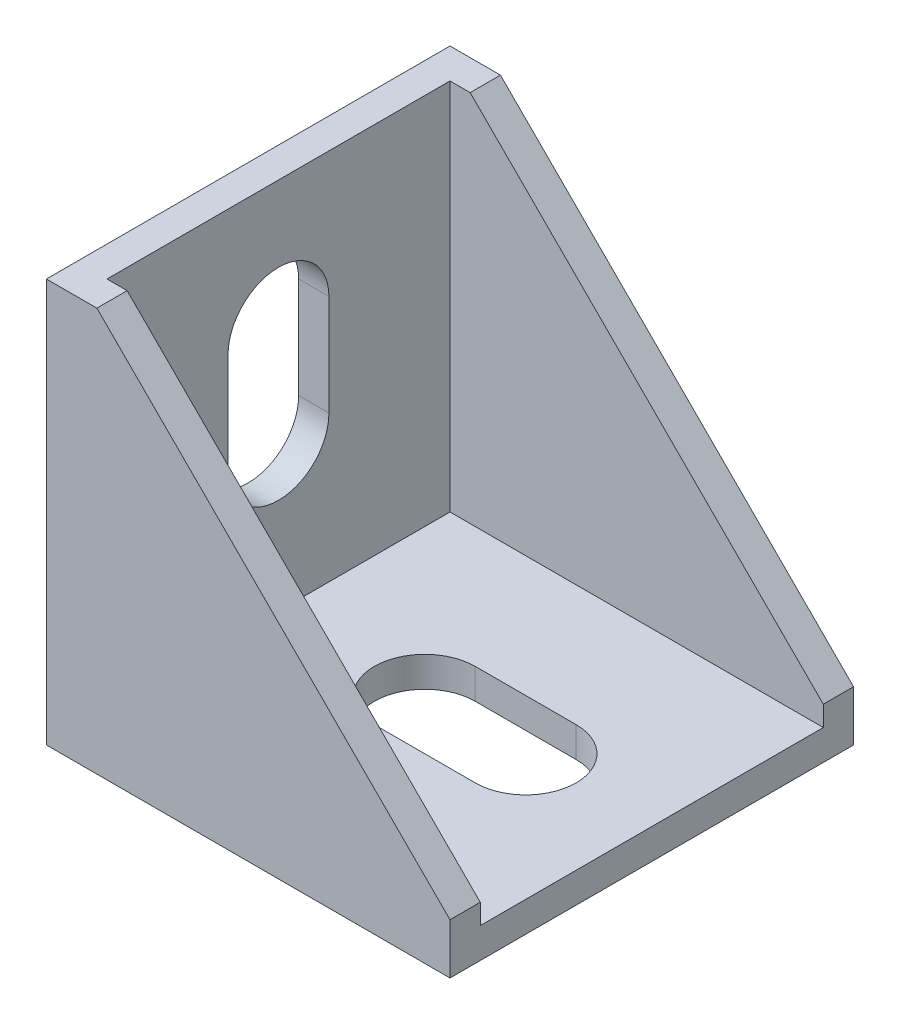
ISO-10303-21;
HEADER;
FILE_DESCRIPTION(('STEP AP214'),'2;1');
FILE_NAME('part.step','',(''),(''),'','','');
FILE_SCHEMA(('AUTOMOTIVE_DESIGN { 1 0 10303 214 1 1 1 1 }'));
ENDSEC;
DATA;
#1=APPLICATION_CONTEXT('core data for automotive mechanical design processes');
#2=APPLICATION_PROTOCOL_DEFINITION('international standard','automotive_design',2000,#1);
#3=PRODUCT_CONTEXT('',#1,'mechanical');
#4=PRODUCT('Part','Part','',(#3));
#5=PRODUCT_RELATED_PRODUCT_CATEGORY('part','',(#4));
#6=PRODUCT_DEFINITION_FORMATION('','',#4);
#7=PRODUCT_DEFINITION_CONTEXT('part definition',#1,'design');
#8=PRODUCT_DEFINITION('design','',#6,#7);
#9=PRODUCT_DEFINITION_SHAPE('','',#8);
#10=(LENGTH_UNIT() NAMED_UNIT(*) SI_UNIT(.MILLI.,.METRE.));
#11=(NAMED_UNIT(*) PLANE_ANGLE_UNIT() SI_UNIT($,.RADIAN.));
#12=(NAMED_UNIT(*) SI_UNIT($,.STERADIAN.) SOLID_ANGLE_UNIT());
#13=UNCERTAINTY_MEASURE_WITH_UNIT(LENGTH_MEASURE(1.E-05),#10,'distance_accuracy_value','');
#14=(GEOMETRIC_REPRESENTATION_CONTEXT(3) GLOBAL_UNCERTAINTY_ASSIGNED_CONTEXT((#13)) GLOBAL_UNIT_ASSIGNED_CONTEXT((#10,
#11,#12)) REPRESENTATION_CONTEXT('',''));
#15=CARTESIAN_POINT('',(0.,0.,0.));
#16=DIRECTION('',(0.,0.,1.));
#17=DIRECTION('',(1.,0.,0.));
#18=AXIS2_PLACEMENT_3D('',#15,#16,#17);
#19=CARTESIAN_POINT('',(40.,0.,20.));
#20=DIRECTION('',(0.,1.,0.));
#21=DIRECTION('',(-1.,0.,0.));
#22=AXIS2_PLACEMENT_3D('',#19,#20,#21);
#23=PLANE('',#22);
#24=DIRECTION('',(1.,0.,0.));
#25=VECTOR('',#24,1.);
#26=CARTESIAN_POINT('',(40.,0.,-20.));
#27=LINE('',#26,#25);
#28=CARTESIAN_POINT('',(0.,0.,-20.));
#29=VERTEX_POINT('',#28);
#30=CARTESIAN_POINT('',(40.,0.,-20.));
#31=VERTEX_POINT('',#30);
#32=EDGE_CURVE('E260',#29,#31,#27,.T.);
#33=ORIENTED_EDGE('',*,*,#32,.T.);
#34=DIRECTION('',(0.,0.,-1.));
#35=VECTOR('',#34,1.);
#36=CARTESIAN_POINT('',(40.,0.,20.));
#37=LINE('',#36,#35);
#38=CARTESIAN_POINT('',(40.,0.,20.));
#39=VERTEX_POINT('',#38);
#40=EDGE_CURVE('E268',#39,#31,#37,.T.);
#41=ORIENTED_EDGE('',*,*,#40,.F.);
#42=DIRECTION('',(1.,0.,0.));
#43=VECTOR('',#42,1.);
#44=CARTESIAN_POINT('',(40.,0.,20.));
#45=LINE('',#44,#43);
#46=CARTESIAN_POINT('',(0.,0.,20.));
#47=VERTEX_POINT('',#46);
#48=EDGE_CURVE('E266',#47,#39,#45,.T.);
#49=ORIENTED_EDGE('',*,*,#48,.F.);
#50=DIRECTION('',(0.,0.,-1.));
#51=VECTOR('',#50,1.);
#52=CARTESIAN_POINT('',(0.,0.,20.));
#53=LINE('',#52,#51);
#54=EDGE_CURVE('E281',#47,#29,#53,.T.);
#55=ORIENTED_EDGE('',*,*,#54,.T.);
#56=EDGE_LOOP('',(#33,#41,#49,#55));
#57=FACE_BOUND('',#56,.T.);
#58=CARTESIAN_POINT('',(27.5,0.,0.));
#59=DIRECTION('',(0.,1.,0.));
#60=DIRECTION('',(-1.,0.,0.));
#61=AXIS2_PLACEMENT_3D('',#58,#59,#60);
#62=CIRCLE('',#61,5.);
#63=CARTESIAN_POINT('',(27.5,0.,-5.));
#64=VERTEX_POINT('',#63);
#65=CARTESIAN_POINT('',(27.5,0.,5.));
#66=VERTEX_POINT('',#65);
#67=EDGE_CURVE('E189',#64,#66,#62,.F.);
#68=ORIENTED_EDGE('',*,*,#67,.F.);
#69=DIRECTION('',(1.,0.,0.));
#70=VECTOR('',#69,1.);
#71=CARTESIAN_POINT('',(40.,0.,-5.));
#72=LINE('',#71,#70);
#73=CARTESIAN_POINT('',(17.5,0.,-5.));
#74=VERTEX_POINT('',#73);
#75=EDGE_CURVE('E182',#74,#64,#72,.T.);
#76=ORIENTED_EDGE('',*,*,#75,.F.);
#77=CARTESIAN_POINT('',(17.5,0.,0.));
#78=DIRECTION('',(0.,1.,0.));
#79=DIRECTION('',(-1.,0.,0.));
#80=AXIS2_PLACEMENT_3D('',#77,#78,#79);
#81=CIRCLE('',#80,5.);
#82=CARTESIAN_POINT('',(17.5,0.,5.));
#83=VERTEX_POINT('',#82);
#84=EDGE_CURVE('E163',#83,#74,#81,.F.);
#85=ORIENTED_EDGE('',*,*,#84,.F.);
#86=DIRECTION('',(-1.,0.,0.));
#87=VECTOR('',#86,1.);
#88=CARTESIAN_POINT('',(40.,0.,5.));
#89=LINE('',#88,#87);
#90=EDGE_CURVE('E187',#66,#83,#89,.T.);
#91=ORIENTED_EDGE('',*,*,#90,.F.);
#92=EDGE_LOOP('',(#68,#76,#85,#91));
#93=FACE_BOUND('',#92,.T.);
#94=ADVANCED_FACE('F32',(#57,#93),#23,.F.);
#95=CARTESIAN_POINT('',(40.,3.,20.));
#96=DIRECTION('',(0.,1.,0.));
#97=DIRECTION('',(-1.,0.,0.));
#98=AXIS2_PLACEMENT_3D('',#95,#96,#97);
#99=PLANE('',#98);
#100=DIRECTION('',(1.,0.,0.));
#101=VECTOR('',#100,1.);
#102=CARTESIAN_POINT('',(0.,3.,-17.));
#103=LINE('',#102,#101);
#104=CARTESIAN_POINT('',(3.,3.,-17.));
#105=VERTEX_POINT('',#104);
#106=CARTESIAN_POINT('',(40.,3.,-17.));
#107=VERTEX_POINT('',#106);
#108=EDGE_CURVE('E226',#105,#107,#103,.T.);
#109=ORIENTED_EDGE('',*,*,#108,.F.);
#110=DIRECTION('',(0.,0.,-1.));
#111=VECTOR('',#110,1.);
#112=CARTESIAN_POINT('',(3.,3.,20.));
#113=LINE('',#112,#111);
#114=CARTESIAN_POINT('',(3.,3.,17.));
#115=VERTEX_POINT('',#114);
#116=EDGE_CURVE('E228',#115,#105,#113,.T.);
#117=ORIENTED_EDGE('',*,*,#116,.F.);
#118=DIRECTION('',(1.,0.,0.));
#119=VECTOR('',#118,1.);
#120=CARTESIAN_POINT('',(0.,3.,17.));
#121=LINE('',#120,#119);
#122=CARTESIAN_POINT('',(40.,3.,17.));
#123=VERTEX_POINT('',#122);
#124=EDGE_CURVE('E235',#115,#123,#121,.T.);
#125=ORIENTED_EDGE('',*,*,#124,.T.);
#126=DIRECTION('',(0.,0.,-1.));
#127=VECTOR('',#126,1.);
#128=CARTESIAN_POINT('',(40.,3.,20.));
#129=LINE('',#128,#127);
#130=EDGE_CURVE('E232',#123,#107,#129,.T.);
#131=ORIENTED_EDGE('',*,*,#130,.T.);
#132=EDGE_LOOP('',(#109,#117,#125,#131));
#133=FACE_BOUND('',#132,.T.);
#134=DIRECTION('',(1.,0.,0.));
#135=VECTOR('',#134,1.);
#136=CARTESIAN_POINT('',(27.5,2.99999999999999,-5.));
#137=LINE('',#136,#135);
#138=CARTESIAN_POINT('',(17.5,3.,-5.));
#139=VERTEX_POINT('',#138);
#140=CARTESIAN_POINT('',(27.5,3.,-5.));
#141=VERTEX_POINT('',#140);
#142=EDGE_CURVE('E169',#139,#141,#137,.T.);
#143=ORIENTED_EDGE('',*,*,#142,.T.);
#144=CARTESIAN_POINT('',(27.5,2.99999999999999,0.));
#145=DIRECTION('',(0.,-1.,0.));
#146=DIRECTION('',(0.,0.,-1.));
#147=AXIS2_PLACEMENT_3D('',#144,#145,#146);
#148=CIRCLE('',#147,5.);
#149=CARTESIAN_POINT('',(27.5,2.99999999999999,5.));
#150=VERTEX_POINT('',#149);
#151=EDGE_CURVE('E55',#141,#150,#148,.T.);
#152=ORIENTED_EDGE('',*,*,#151,.T.);
#153=DIRECTION('',(-1.,0.,0.));
#154=VECTOR('',#153,1.);
#155=CARTESIAN_POINT('',(27.5,2.99999999999999,5.));
#156=LINE('',#155,#154);
#157=CARTESIAN_POINT('',(17.5,3.,5.));
#158=VERTEX_POINT('',#157);
#159=EDGE_CURVE('E175',#150,#158,#156,.T.);
#160=ORIENTED_EDGE('',*,*,#159,.T.);
#161=CARTESIAN_POINT('',(17.5,3.,0.));
#162=DIRECTION('',(0.,-1.,0.));
#163=DIRECTION('',(0.,0.,-1.));
#164=AXIS2_PLACEMENT_3D('',#161,#162,#163);
#165=CIRCLE('',#164,5.);
#166=EDGE_CURVE('E160',#158,#139,#165,.T.);
#167=ORIENTED_EDGE('',*,*,#166,.T.);
#168=EDGE_LOOP('',(#143,#152,#160,#167));
#169=FACE_BOUND('',#168,.T.);
#170=ADVANCED_FACE('F173',(#133,#169),#99,.T.);
#171=CARTESIAN_POINT('',(40.,5.,20.));
#172=DIRECTION('',(-1.,0.,0.));
#173=DIRECTION('',(0.,0.,1.));
#174=AXIS2_PLACEMENT_3D('',#171,#172,#173);
#175=PLANE('',#174);
#176=DIRECTION('',(0.,1.,0.));
#177=VECTOR('',#176,1.);
#178=CARTESIAN_POINT('',(40.,0.,-17.));
#179=LINE('',#178,#177);
#180=CARTESIAN_POINT('',(40.,5.,-17.));
#181=VERTEX_POINT('',#180);
#182=EDGE_CURVE('E223',#107,#181,#179,.T.);
#183=ORIENTED_EDGE('',*,*,#182,.F.);
#184=ORIENTED_EDGE('',*,*,#130,.F.);
#185=DIRECTION('',(0.,1.,0.));
#186=VECTOR('',#185,1.);
#187=CARTESIAN_POINT('',(40.,0.,17.));
#188=LINE('',#187,#186);
#189=CARTESIAN_POINT('',(40.,5.,17.));
#190=VERTEX_POINT('',#189);
#191=EDGE_CURVE('E238',#123,#190,#188,.T.);
#192=ORIENTED_EDGE('',*,*,#191,.T.);
#193=DIRECTION('',(0.,0.,-1.));
#194=VECTOR('',#193,1.);
#195=CARTESIAN_POINT('',(40.,5.,20.));
#196=LINE('',#195,#194);
#197=CARTESIAN_POINT('',(40.,5.,20.));
#198=VERTEX_POINT('',#197);
#199=EDGE_CURVE('E11',#198,#190,#196,.T.);
#200=ORIENTED_EDGE('',*,*,#199,.F.);
#201=DIRECTION('',(0.,1.,0.));
#202=VECTOR('',#201,1.);
#203=CARTESIAN_POINT('',(40.,5.,20.));
#204=LINE('',#203,#202);
#205=EDGE_CURVE('E256',#39,#198,#204,.T.);
#206=ORIENTED_EDGE('',*,*,#205,.F.);
#207=ORIENTED_EDGE('',*,*,#40,.T.);
#208=DIRECTION('',(0.,1.,0.));
#209=VECTOR('',#208,1.);
#210=CARTESIAN_POINT('',(40.,5.,-20.));
#211=LINE('',#210,#209);
#212=CARTESIAN_POINT('',(40.,5.,-20.));
#213=VERTEX_POINT('',#212);
#214=EDGE_CURVE('E242',#31,#213,#211,.T.);
#215=ORIENTED_EDGE('',*,*,#214,.T.);
#216=EDGE_CURVE('E40',#181,#213,#196,.T.);
#217=ORIENTED_EDGE('',*,*,#216,.F.);
#218=EDGE_LOOP('',(#183,#184,#192,#200,#206,#207,#215,#217));
#219=FACE_BOUND('',#218,.T.);
#220=ADVANCED_FACE('F34',(#219),#175,.F.);
#221=CARTESIAN_POINT('',(5.,40.,20.));
#222=DIRECTION('',(-0.707106781186548,-0.707106781186548,0.));
#223=DIRECTION('',(0.707106781186548,-0.707106781186548,0.));
#224=AXIS2_PLACEMENT_3D('',#221,#222,#223);
#225=PLANE('',#224);
#226=DIRECTION('',(-0.707106781186548,0.707106781186548,0.));
#227=VECTOR('',#226,1.);
#228=CARTESIAN_POINT('',(22.5,22.5,-17.));
#229=LINE('',#228,#227);
#230=CARTESIAN_POINT('',(5.,40.,-17.));
#231=VERTEX_POINT('',#230);
#232=EDGE_CURVE('E253',#181,#231,#229,.T.);
#233=ORIENTED_EDGE('',*,*,#232,.F.);
#234=ORIENTED_EDGE('',*,*,#216,.T.);
#235=DIRECTION('',(-0.707106781186548,0.707106781186548,0.));
#236=VECTOR('',#235,1.);
#237=CARTESIAN_POINT('',(5.,40.,-20.));
#238=LINE('',#237,#236);
#239=CARTESIAN_POINT('',(5.,40.,-20.));
#240=VERTEX_POINT('',#239);
#241=EDGE_CURVE('E271',#213,#240,#238,.T.);
#242=ORIENTED_EDGE('',*,*,#241,.T.);
#243=DIRECTION('',(0.,0.,-1.));
#244=VECTOR('',#243,1.);
#245=CARTESIAN_POINT('',(5.,40.,20.));
#246=LINE('',#245,#244);
#247=EDGE_CURVE('E286',#231,#240,#246,.T.);
#248=ORIENTED_EDGE('',*,*,#247,.F.);
#249=EDGE_LOOP('',(#233,#234,#242,#248));
#250=FACE_BOUND('',#249,.T.);
#251=ADVANCED_FACE('F300',(#250),#225,.F.);
#252=CARTESIAN_POINT('',(0.,40.,20.));
#253=DIRECTION('',(0.,-1.,0.));
#254=DIRECTION('',(0.,0.,-1.));
#255=AXIS2_PLACEMENT_3D('',#252,#253,#254);
#256=PLANE('',#255);
#257=DIRECTION('',(-1.,0.,0.));
#258=VECTOR('',#257,1.);
#259=CARTESIAN_POINT('',(0.,40.,-17.));
#260=LINE('',#259,#258);
#261=CARTESIAN_POINT('',(3.,40.,-17.));
#262=VERTEX_POINT('',#261);
#263=EDGE_CURVE('E227',#231,#262,#260,.T.);
#264=ORIENTED_EDGE('',*,*,#263,.F.);
#265=ORIENTED_EDGE('',*,*,#247,.T.);
#266=DIRECTION('',(-1.,0.,0.));
#267=VECTOR('',#266,1.);
#268=CARTESIAN_POINT('',(0.,40.,-20.));
#269=LINE('',#268,#267);
#270=CARTESIAN_POINT('',(0.,40.,-20.));
#271=VERTEX_POINT('',#270);
#272=EDGE_CURVE('E274',#240,#271,#269,.T.);
#273=ORIENTED_EDGE('',*,*,#272,.T.);
#274=DIRECTION('',(0.,0.,-1.));
#275=VECTOR('',#274,1.);
#276=CARTESIAN_POINT('',(0.,40.,20.));
#277=LINE('',#276,#275);
#278=CARTESIAN_POINT('',(0.,40.,20.));
#279=VERTEX_POINT('',#278);
#280=EDGE_CURVE('E284',#279,#271,#277,.T.);
#281=ORIENTED_EDGE('',*,*,#280,.F.);
#282=DIRECTION('',(-1.,0.,0.));
#283=VECTOR('',#282,1.);
#284=CARTESIAN_POINT('',(0.,40.,20.));
#285=LINE('',#284,#283);
#286=CARTESIAN_POINT('',(5.,40.,20.));
#287=VERTEX_POINT('',#286);
#288=EDGE_CURVE('E262',#287,#279,#285,.T.);
#289=ORIENTED_EDGE('',*,*,#288,.F.);
#290=CARTESIAN_POINT('',(5.,40.,17.));
#291=VERTEX_POINT('',#290);
#292=EDGE_CURVE('E287',#287,#291,#246,.T.);
#293=ORIENTED_EDGE('',*,*,#292,.T.);
#294=DIRECTION('',(-1.,0.,0.));
#295=VECTOR('',#294,1.);
#296=CARTESIAN_POINT('',(0.,40.,17.));
#297=LINE('',#296,#295);
#298=CARTESIAN_POINT('',(3.,40.,17.));
#299=VERTEX_POINT('',#298);
#300=EDGE_CURVE('E236',#291,#299,#297,.T.);
#301=ORIENTED_EDGE('',*,*,#300,.T.);
#302=DIRECTION('',(0.,0.,-1.));
#303=VECTOR('',#302,1.);
#304=CARTESIAN_POINT('',(3.,40.,20.));
#305=LINE('',#304,#303);
#306=EDGE_CURVE('E231',#299,#262,#305,.T.);
#307=ORIENTED_EDGE('',*,*,#306,.T.);
#308=EDGE_LOOP('',(#264,#265,#273,#281,#289,#293,#301,#307));
#309=FACE_BOUND('',#308,.T.);
#310=ADVANCED_FACE('F294',(#309),#256,.F.);
#311=ORIENTED_EDGE('',*,*,#199,.T.);
#312=DIRECTION('',(-0.707106781186548,0.707106781186548,0.));
#313=VECTOR('',#312,1.);
#314=CARTESIAN_POINT('',(22.5,22.5,17.));
#315=LINE('',#314,#313);
#316=EDGE_CURVE('E245',#190,#291,#315,.T.);
#317=ORIENTED_EDGE('',*,*,#316,.T.);
#318=ORIENTED_EDGE('',*,*,#292,.F.);
#319=DIRECTION('',(-0.707106781186548,0.707106781186548,0.));
#320=VECTOR('',#319,1.);
#321=CARTESIAN_POINT('',(5.,40.,20.));
#322=LINE('',#321,#320);
#323=EDGE_CURVE('E259',#198,#287,#322,.T.);
#324=ORIENTED_EDGE('',*,*,#323,.F.);
#325=EDGE_LOOP('',(#311,#317,#318,#324));
#326=FACE_BOUND('',#325,.T.);
#327=ADVANCED_FACE('F320',(#326),#225,.F.);
#328=CARTESIAN_POINT('',(0.,0.,20.));
#329=DIRECTION('',(1.,0.,0.));
#330=DIRECTION('',(0.,0.,-1.));
#331=AXIS2_PLACEMENT_3D('',#328,#329,#330);
#332=PLANE('',#331);
#333=DIRECTION('',(0.,1.,0.));
#334=VECTOR('',#333,1.);
#335=CARTESIAN_POINT('',(0.,0.,-5.));
#336=LINE('',#335,#334);
#337=CARTESIAN_POINT('',(0.,17.5,-5.));
#338=VERTEX_POINT('',#337);
#339=CARTESIAN_POINT('',(0.,27.5,-5.));
#340=VERTEX_POINT('',#339);
#341=EDGE_CURVE('E217',#338,#340,#336,.T.);
#342=ORIENTED_EDGE('',*,*,#341,.T.);
#343=CARTESIAN_POINT('',(0.,27.5,0.));
#344=DIRECTION('',(1.,0.,0.));
#345=DIRECTION('',(0.,0.,-1.));
#346=AXIS2_PLACEMENT_3D('',#343,#344,#345);
#347=CIRCLE('',#346,5.);
#348=CARTESIAN_POINT('',(0.,27.5,5.));
#349=VERTEX_POINT('',#348);
#350=EDGE_CURVE('E220',#340,#349,#347,.T.);
#351=ORIENTED_EDGE('',*,*,#350,.T.);
#352=DIRECTION('',(0.,-1.,0.));
#353=VECTOR('',#352,1.);
#354=CARTESIAN_POINT('',(0.,0.,5.));
#355=LINE('',#354,#353);
#356=CARTESIAN_POINT('',(0.,17.5,5.));
#357=VERTEX_POINT('',#356);
#358=EDGE_CURVE('E205',#349,#357,#355,.T.);
#359=ORIENTED_EDGE('',*,*,#358,.T.);
#360=CARTESIAN_POINT('',(0.,17.5,0.));
#361=DIRECTION('',(1.,0.,0.));
#362=DIRECTION('',(0.,0.,-1.));
#363=AXIS2_PLACEMENT_3D('',#360,#361,#362);
#364=CIRCLE('',#363,5.);
#365=EDGE_CURVE('E214',#357,#338,#364,.T.);
#366=ORIENTED_EDGE('',*,*,#365,.T.);
#367=EDGE_LOOP('',(#342,#351,#359,#366));
#368=FACE_BOUND('',#367,.T.);
#369=DIRECTION('',(0.,-1.,0.));
#370=VECTOR('',#369,1.);
#371=CARTESIAN_POINT('',(0.,0.,-20.));
#372=LINE('',#371,#370);
#373=EDGE_CURVE('E276',#271,#29,#372,.T.);
#374=ORIENTED_EDGE('',*,*,#373,.T.);
#375=ORIENTED_EDGE('',*,*,#54,.F.);
#376=DIRECTION('',(0.,-1.,0.));
#377=VECTOR('',#376,1.);
#378=CARTESIAN_POINT('',(0.,0.,20.));
#379=LINE('',#378,#377);
#380=EDGE_CURVE('E264',#279,#47,#379,.T.);
#381=ORIENTED_EDGE('',*,*,#380,.F.);
#382=ORIENTED_EDGE('',*,*,#280,.T.);
#383=EDGE_LOOP('',(#374,#375,#381,#382));
#384=FACE_BOUND('',#383,.T.);
#385=ADVANCED_FACE('F309',(#368,#384),#332,.F.);
#386=CARTESIAN_POINT('',(0.,0.,20.));
#387=DIRECTION('',(0.,0.,-1.));
#388=DIRECTION('',(-1.,0.,0.));
#389=AXIS2_PLACEMENT_3D('',#386,#387,#388);
#390=PLANE('',#389);
#391=ORIENTED_EDGE('',*,*,#205,.T.);
#392=ORIENTED_EDGE('',*,*,#323,.T.);
#393=ORIENTED_EDGE('',*,*,#288,.T.);
#394=ORIENTED_EDGE('',*,*,#380,.T.);
#395=ORIENTED_EDGE('',*,*,#48,.T.);
#396=EDGE_LOOP('',(#391,#392,#393,#394,#395));
#397=FACE_BOUND('',#396,.T.);
#398=ADVANCED_FACE('F317',(#397),#390,.F.);
#399=CARTESIAN_POINT('',(0.,0.,-20.));
#400=DIRECTION('',(0.,0.,-1.));
#401=DIRECTION('',(-1.,0.,0.));
#402=AXIS2_PLACEMENT_3D('',#399,#400,#401);
#403=PLANE('',#402);
#404=ORIENTED_EDGE('',*,*,#214,.F.);
#405=ORIENTED_EDGE('',*,*,#32,.F.);
#406=ORIENTED_EDGE('',*,*,#373,.F.);
#407=ORIENTED_EDGE('',*,*,#272,.F.);
#408=ORIENTED_EDGE('',*,*,#241,.F.);
#409=EDGE_LOOP('',(#404,#405,#406,#407,#408));
#410=FACE_BOUND('',#409,.T.);
#411=ADVANCED_FACE('F305',(#410),#403,.T.);
#412=CARTESIAN_POINT('',(3.,0.,20.));
#413=DIRECTION('',(1.,0.,0.));
#414=DIRECTION('',(0.,0.,-1.));
#415=AXIS2_PLACEMENT_3D('',#412,#413,#414);
#416=PLANE('',#415);
#417=CARTESIAN_POINT('',(3.,27.5,0.));
#418=DIRECTION('',(1.,0.,0.));
#419=DIRECTION('',(0.,0.,-1.));
#420=AXIS2_PLACEMENT_3D('',#417,#418,#419);
#421=CIRCLE('',#420,5.);
#422=CARTESIAN_POINT('',(3.,27.5,-5.));
#423=VERTEX_POINT('',#422);
#424=CARTESIAN_POINT('',(3.,27.5,5.));
#425=VERTEX_POINT('',#424);
#426=EDGE_CURVE('E191',#423,#425,#421,.T.);
#427=ORIENTED_EDGE('',*,*,#426,.F.);
#428=DIRECTION('',(0.,1.,0.));
#429=VECTOR('',#428,1.);
#430=CARTESIAN_POINT('',(3.,27.5,-5.));
#431=LINE('',#430,#429);
#432=CARTESIAN_POINT('',(3.,17.5,-5.));
#433=VERTEX_POINT('',#432);
#434=EDGE_CURVE('E199',#433,#423,#431,.T.);
#435=ORIENTED_EDGE('',*,*,#434,.F.);
#436=CARTESIAN_POINT('',(3.,17.5,0.));
#437=DIRECTION('',(1.,0.,0.));
#438=DIRECTION('',(0.,0.,-1.));
#439=AXIS2_PLACEMENT_3D('',#436,#437,#438);
#440=CIRCLE('',#439,5.);
#441=CARTESIAN_POINT('',(3.,17.5,5.));
#442=VERTEX_POINT('',#441);
#443=EDGE_CURVE('E196',#442,#433,#440,.T.);
#444=ORIENTED_EDGE('',*,*,#443,.F.);
#445=DIRECTION('',(0.,-1.,0.));
#446=VECTOR('',#445,1.);
#447=CARTESIAN_POINT('',(3.,27.5,5.));
#448=LINE('',#447,#446);
#449=EDGE_CURVE('E193',#425,#442,#448,.T.);
#450=ORIENTED_EDGE('',*,*,#449,.F.);
#451=EDGE_LOOP('',(#427,#435,#444,#450));
#452=FACE_BOUND('',#451,.T.);
#453=DIRECTION('',(0.,-1.,0.));
#454=VECTOR('',#453,1.);
#455=CARTESIAN_POINT('',(3.,0.,-17.));
#456=LINE('',#455,#454);
#457=EDGE_CURVE('E224',#262,#105,#456,.T.);
#458=ORIENTED_EDGE('',*,*,#457,.F.);
#459=ORIENTED_EDGE('',*,*,#306,.F.);
#460=DIRECTION('',(0.,-1.,0.));
#461=VECTOR('',#460,1.);
#462=CARTESIAN_POINT('',(3.,0.,17.));
#463=LINE('',#462,#461);
#464=EDGE_CURVE('E233',#299,#115,#463,.T.);
#465=ORIENTED_EDGE('',*,*,#464,.T.);
#466=ORIENTED_EDGE('',*,*,#116,.T.);
#467=EDGE_LOOP('',(#458,#459,#465,#466));
#468=FACE_BOUND('',#467,.T.);
#469=ADVANCED_FACE('F334',(#452,#468),#416,.T.);
#470=CARTESIAN_POINT('',(0.,0.,17.));
#471=DIRECTION('',(0.,0.,-1.));
#472=DIRECTION('',(-1.,0.,0.));
#473=AXIS2_PLACEMENT_3D('',#470,#471,#472);
#474=PLANE('',#473);
#475=ORIENTED_EDGE('',*,*,#191,.F.);
#476=ORIENTED_EDGE('',*,*,#124,.F.);
#477=ORIENTED_EDGE('',*,*,#464,.F.);
#478=ORIENTED_EDGE('',*,*,#300,.F.);
#479=ORIENTED_EDGE('',*,*,#316,.F.);
#480=EDGE_LOOP('',(#475,#476,#477,#478,#479));
#481=FACE_BOUND('',#480,.T.);
#482=ADVANCED_FACE('F323',(#481),#474,.T.);
#483=CARTESIAN_POINT('',(0.,0.,-17.));
#484=DIRECTION('',(0.,0.,-1.));
#485=DIRECTION('',(-1.,0.,0.));
#486=AXIS2_PLACEMENT_3D('',#483,#484,#485);
#487=PLANE('',#486);
#488=ORIENTED_EDGE('',*,*,#182,.T.);
#489=ORIENTED_EDGE('',*,*,#232,.T.);
#490=ORIENTED_EDGE('',*,*,#263,.T.);
#491=ORIENTED_EDGE('',*,*,#457,.T.);
#492=ORIENTED_EDGE('',*,*,#108,.T.);
#493=EDGE_LOOP('',(#488,#489,#490,#491,#492));
#494=FACE_BOUND('',#493,.T.);
#495=ADVANCED_FACE('F336',(#494),#487,.F.);
#496=CARTESIAN_POINT('',(-37.,27.5,0.));
#497=DIRECTION('',(1.,0.,0.));
#498=DIRECTION('',(0.,0.,-1.));
#499=AXIS2_PLACEMENT_3D('',#496,#497,#498);
#500=CYLINDRICAL_SURFACE('',#499,5.);
#501=DIRECTION('',(1.,0.,0.));
#502=VECTOR('',#501,1.);
#503=CARTESIAN_POINT('',(-37.,27.5,-5.));
#504=LINE('',#503,#502);
#505=EDGE_CURVE('E203',#340,#423,#504,.T.);
#506=ORIENTED_EDGE('',*,*,#505,.T.);
#507=ORIENTED_EDGE('',*,*,#426,.T.);
#508=DIRECTION('',(1.,0.,0.));
#509=VECTOR('',#508,1.);
#510=CARTESIAN_POINT('',(-37.,27.5,5.));
#511=LINE('',#510,#509);
#512=EDGE_CURVE('E202',#349,#425,#511,.T.);
#513=ORIENTED_EDGE('',*,*,#512,.F.);
#514=ORIENTED_EDGE('',*,*,#350,.F.);
#515=EDGE_LOOP('',(#506,#507,#513,#514));
#516=FACE_BOUND('',#515,.T.);
#517=ADVANCED_FACE('F338',(#516),#500,.F.);
#518=CARTESIAN_POINT('',(-37.,27.5,-5.));
#519=DIRECTION('',(0.,0.,-1.));
#520=DIRECTION('',(0.,1.,0.));
#521=AXIS2_PLACEMENT_3D('',#518,#519,#520);
#522=PLANE('',#521);
#523=DIRECTION('',(1.,0.,0.));
#524=VECTOR('',#523,1.);
#525=CARTESIAN_POINT('',(-37.,17.5,-5.));
#526=LINE('',#525,#524);
#527=EDGE_CURVE('E206',#338,#433,#526,.T.);
#528=ORIENTED_EDGE('',*,*,#527,.T.);
#529=ORIENTED_EDGE('',*,*,#434,.T.);
#530=ORIENTED_EDGE('',*,*,#505,.F.);
#531=ORIENTED_EDGE('',*,*,#341,.F.);
#532=EDGE_LOOP('',(#528,#529,#530,#531));
#533=FACE_BOUND('',#532,.T.);
#534=ADVANCED_FACE('F344',(#533),#522,.F.);
#535=CARTESIAN_POINT('',(-37.,17.5,0.));
#536=DIRECTION('',(1.,0.,0.));
#537=DIRECTION('',(0.,0.,-1.));
#538=AXIS2_PLACEMENT_3D('',#535,#536,#537);
#539=CYLINDRICAL_SURFACE('',#538,5.);
#540=DIRECTION('',(1.,0.,0.));
#541=VECTOR('',#540,1.);
#542=CARTESIAN_POINT('',(-37.,17.5,5.));
#543=LINE('',#542,#541);
#544=EDGE_CURVE('E208',#357,#442,#543,.T.);
#545=ORIENTED_EDGE('',*,*,#544,.T.);
#546=ORIENTED_EDGE('',*,*,#443,.T.);
#547=ORIENTED_EDGE('',*,*,#527,.F.);
#548=ORIENTED_EDGE('',*,*,#365,.F.);
#549=EDGE_LOOP('',(#545,#546,#547,#548));
#550=FACE_BOUND('',#549,.T.);
#551=ADVANCED_FACE('F423',(#550),#539,.F.);
#552=CARTESIAN_POINT('',(-37.,27.5,5.));
#553=DIRECTION('',(0.,0.,1.));
#554=DIRECTION('',(0.,-1.,0.));
#555=AXIS2_PLACEMENT_3D('',#552,#553,#554);
#556=PLANE('',#555);
#557=ORIENTED_EDGE('',*,*,#512,.T.);
#558=ORIENTED_EDGE('',*,*,#449,.T.);
#559=ORIENTED_EDGE('',*,*,#544,.F.);
#560=ORIENTED_EDGE('',*,*,#358,.F.);
#561=EDGE_LOOP('',(#557,#558,#559,#560));
#562=FACE_BOUND('',#561,.T.);
#563=ADVANCED_FACE('F390',(#562),#556,.F.);
#564=CARTESIAN_POINT('',(27.5,-37.,0.));
#565=DIRECTION('',(0.,1.,0.));
#566=DIRECTION('',(-1.,0.,0.));
#567=AXIS2_PLACEMENT_3D('',#564,#565,#566);
#568=CYLINDRICAL_SURFACE('',#567,5.);
#569=ORIENTED_EDGE('',*,*,#67,.T.);
#570=DIRECTION('',(0.,1.,0.));
#571=VECTOR('',#570,1.);
#572=CARTESIAN_POINT('',(27.5,-37.,5.));
#573=LINE('',#572,#571);
#574=EDGE_CURVE('E180',#66,#150,#573,.T.);
#575=ORIENTED_EDGE('',*,*,#574,.T.);
#576=ORIENTED_EDGE('',*,*,#151,.F.);
#577=DIRECTION('',(0.,1.,0.));
#578=VECTOR('',#577,1.);
#579=CARTESIAN_POINT('',(27.5,-37.,-5.));
#580=LINE('',#579,#578);
#581=EDGE_CURVE('E166',#64,#141,#580,.T.);
#582=ORIENTED_EDGE('',*,*,#581,.F.);
#583=EDGE_LOOP('',(#569,#575,#576,#582));
#584=FACE_BOUND('',#583,.T.);
#585=ADVANCED_FACE('F384',(#584),#568,.F.);
#586=CARTESIAN_POINT('',(27.5,-37.,5.));
#587=DIRECTION('',(0.,0.,-1.));
#588=DIRECTION('',(-1.,0.,0.));
#589=AXIS2_PLACEMENT_3D('',#586,#587,#588);
#590=PLANE('',#589);
#591=ORIENTED_EDGE('',*,*,#90,.T.);
#592=DIRECTION('',(0.,1.,0.));
#593=VECTOR('',#592,1.);
#594=CARTESIAN_POINT('',(17.5,-37.,5.));
#595=LINE('',#594,#593);
#596=EDGE_CURVE('E165',#83,#158,#595,.T.);
#597=ORIENTED_EDGE('',*,*,#596,.T.);
#598=ORIENTED_EDGE('',*,*,#159,.F.);
#599=ORIENTED_EDGE('',*,*,#574,.F.);
#600=EDGE_LOOP('',(#591,#597,#598,#599));
#601=FACE_BOUND('',#600,.T.);
#602=ADVANCED_FACE('F389',(#601),#590,.T.);
#603=CARTESIAN_POINT('',(17.5,-37.,0.));
#604=DIRECTION('',(0.,1.,0.));
#605=DIRECTION('',(-1.,0.,0.));
#606=AXIS2_PLACEMENT_3D('',#603,#604,#605);
#607=CYLINDRICAL_SURFACE('',#606,5.);
#608=ORIENTED_EDGE('',*,*,#84,.T.);
#609=DIRECTION('',(0.,1.,0.));
#610=VECTOR('',#609,1.);
#611=CARTESIAN_POINT('',(17.5,-37.,-5.));
#612=LINE('',#611,#610);
#613=EDGE_CURVE('E47',#74,#139,#612,.T.);
#614=ORIENTED_EDGE('',*,*,#613,.T.);
#615=ORIENTED_EDGE('',*,*,#166,.F.);
#616=ORIENTED_EDGE('',*,*,#596,.F.);
#617=EDGE_LOOP('',(#608,#614,#615,#616));
#618=FACE_BOUND('',#617,.T.);
#619=ADVANCED_FACE('F157',(#618),#607,.F.);
#620=CARTESIAN_POINT('',(27.5,-37.,-5.));
#621=DIRECTION('',(0.,0.,1.));
#622=DIRECTION('',(1.,0.,0.));
#623=AXIS2_PLACEMENT_3D('',#620,#621,#622);
#624=PLANE('',#623);
#625=ORIENTED_EDGE('',*,*,#75,.T.);
#626=ORIENTED_EDGE('',*,*,#581,.T.);
#627=ORIENTED_EDGE('',*,*,#142,.F.);
#628=ORIENTED_EDGE('',*,*,#613,.F.);
#629=EDGE_LOOP('',(#625,#626,#627,#628));
#630=FACE_BOUND('',#629,.T.);
#631=ADVANCED_FACE('F170',(#630),#624,.T.);
#632=CLOSED_SHELL('',(#94,#170,#220,#251,#310,#327,#385,#398,#411,#469,#482,#495,#517,#534,#551,
#563,#585,#602,#619,#631));
#633=MANIFOLD_SOLID_BREP('B2',#632);
#634=ADVANCED_BREP_SHAPE_REPRESENTATION('',(#18,#633),#14);
#635=SHAPE_DEFINITION_REPRESENTATION(#9,#634);
ENDSEC;
END-ISO-10303-21;
